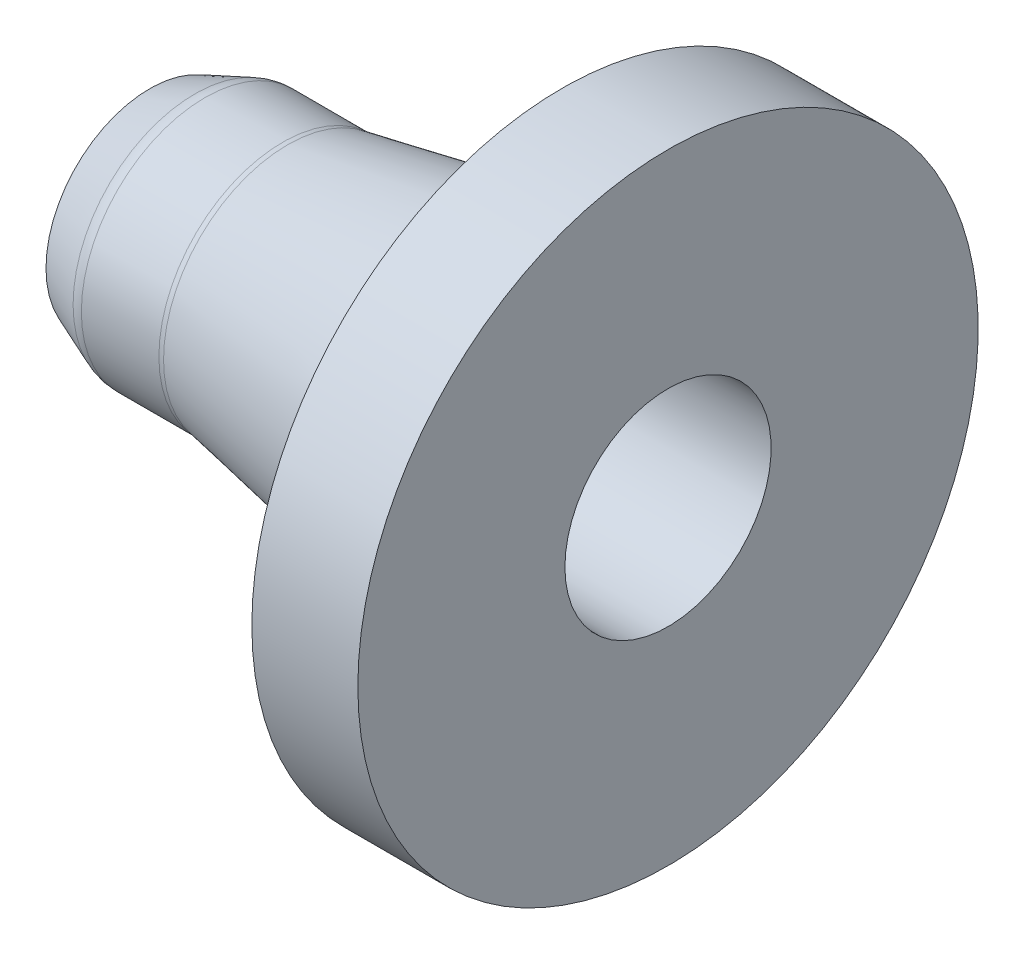
ISO-10303-21;
HEADER;
FILE_DESCRIPTION(('STEP AP214'),'2;1');
FILE_NAME('part.step','',(''),(''),'','','');
FILE_SCHEMA(('AUTOMOTIVE_DESIGN { 1 0 10303 214 1 1 1 1 }'));
ENDSEC;
DATA;
#1=APPLICATION_CONTEXT('core data for automotive mechanical design processes');
#2=APPLICATION_PROTOCOL_DEFINITION('international standard','automotive_design',2000,#1);
#3=PRODUCT_CONTEXT('',#1,'mechanical');
#4=PRODUCT('Part','Part','',(#3));
#5=PRODUCT_RELATED_PRODUCT_CATEGORY('part','',(#4));
#6=PRODUCT_DEFINITION_FORMATION('','',#4);
#7=PRODUCT_DEFINITION_CONTEXT('part definition',#1,'design');
#8=PRODUCT_DEFINITION('design','',#6,#7);
#9=PRODUCT_DEFINITION_SHAPE('','',#8);
#10=(LENGTH_UNIT() NAMED_UNIT(*) SI_UNIT(.MILLI.,.METRE.));
#11=(NAMED_UNIT(*) PLANE_ANGLE_UNIT() SI_UNIT($,.RADIAN.));
#12=(NAMED_UNIT(*) SI_UNIT($,.STERADIAN.) SOLID_ANGLE_UNIT());
#13=UNCERTAINTY_MEASURE_WITH_UNIT(LENGTH_MEASURE(1.E-05),#10,'distance_accuracy_value','');
#14=(GEOMETRIC_REPRESENTATION_CONTEXT(3) GLOBAL_UNCERTAINTY_ASSIGNED_CONTEXT((#13)) GLOBAL_UNIT_ASSIGNED_CONTEXT((#10,
#11,#12)) REPRESENTATION_CONTEXT('',''));
#15=CARTESIAN_POINT('',(0.,0.,0.));
#16=DIRECTION('',(0.,0.,1.));
#17=DIRECTION('',(1.,0.,0.));
#18=AXIS2_PLACEMENT_3D('',#15,#16,#17);
#19=CARTESIAN_POINT('',(0.,0.,0.));
#20=DIRECTION('',(-1.,0.,0.));
#21=DIRECTION('',(0.,0.,1.));
#22=AXIS2_PLACEMENT_3D('',#19,#20,#21);
#23=CYLINDRICAL_SURFACE('',#22,0.75);
#24=CARTESIAN_POINT('',(3.79395727756807,0.,0.));
#25=DIRECTION('',(-1.,0.,0.));
#26=DIRECTION('',(0.,0.,1.));
#27=AXIS2_PLACEMENT_3D('',#24,#25,#26);
#28=CIRCLE('',#27,0.75);
#29=CARTESIAN_POINT('',(3.79395727756807,0.,0.75));
#30=VERTEX_POINT('',#29);
#31=EDGE_CURVE('E76',#30,#30,#28,.T.);
#32=ORIENTED_EDGE('',*,*,#31,.F.);
#33=EDGE_LOOP('',(#32));
#34=FACE_BOUND('',#33,.T.);
#35=CARTESIAN_POINT('',(0.0239572775680751,0.,0.));
#36=DIRECTION('',(-1.,0.,0.));
#37=DIRECTION('',(0.,0.,1.));
#38=AXIS2_PLACEMENT_3D('',#35,#36,#37);
#39=CIRCLE('',#38,0.75);
#40=CARTESIAN_POINT('',(0.0239572775680751,0.,0.75));
#41=VERTEX_POINT('',#40);
#42=EDGE_CURVE('E55',#41,#41,#39,.T.);
#43=ORIENTED_EDGE('',*,*,#42,.T.);
#44=EDGE_LOOP('',(#43));
#45=FACE_BOUND('',#44,.T.);
#46=ADVANCED_FACE('F35',(#34,#45),#23,.F.);
#47=CARTESIAN_POINT('',(0.0239572775680752,0.75,0.));
#48=DIRECTION('',(1.,0.,0.));
#49=DIRECTION('',(0.,0.,-1.));
#50=AXIS2_PLACEMENT_3D('',#47,#48,#49);
#51=PLANE('',#50);
#52=ORIENTED_EDGE('',*,*,#42,.F.);
#53=EDGE_LOOP('',(#52));
#54=FACE_BOUND('',#53,.T.);
#55=CARTESIAN_POINT('',(0.0239572775680752,0.,0.));
#56=DIRECTION('',(-1.,0.,0.));
#57=DIRECTION('',(0.,0.,1.));
#58=AXIS2_PLACEMENT_3D('',#55,#56,#57);
#59=CIRCLE('',#58,0.754156771666013);
#60=CARTESIAN_POINT('',(0.0239572775680752,0.,0.754156771666013));
#61=VERTEX_POINT('',#60);
#62=EDGE_CURVE('E58',#61,#61,#59,.T.);
#63=ORIENTED_EDGE('',*,*,#62,.T.);
#64=EDGE_LOOP('',(#63));
#65=FACE_BOUND('',#64,.T.);
#66=ADVANCED_FACE('F84',(#54,#65),#51,.F.);
#67=CARTESIAN_POINT('',(0.388348543336103,0.,0.));
#68=DIRECTION('',(1.,0.,0.));
#69=DIRECTION('',(0.,0.,-1.));
#70=AXIS2_PLACEMENT_3D('',#67,#68,#69);
#71=CONICAL_SURFACE('',#70,0.9,0.38071152536673);
#72=CARTESIAN_POINT('',(0.352570071366835,0.,0.));
#73=DIRECTION('',(-1.,0.,0.));
#74=DIRECTION('',(0.,0.,1.));
#75=AXIS2_PLACEMENT_3D('',#72,#73,#74);
#76=CIRCLE('',#75,0.885680096239801);
#77=CARTESIAN_POINT('',(0.352570071366835,0.,0.885680096239801));
#78=VERTEX_POINT('',#77);
#79=EDGE_CURVE('E50',#78,#78,#76,.T.);
#80=ORIENTED_EDGE('',*,*,#79,.T.);
#81=EDGE_LOOP('',(#80));
#82=FACE_BOUND('',#81,.T.);
#83=ORIENTED_EDGE('',*,*,#62,.F.);
#84=EDGE_LOOP('',(#83));
#85=FACE_BOUND('',#84,.T.);
#86=ADVANCED_FACE('F90',(#82,#85),#71,.T.);
#87=CARTESIAN_POINT('',(0.,0.,0.));
#88=DIRECTION('',(-1.,0.,0.));
#89=DIRECTION('',(0.,0.,1.));
#90=AXIS2_PLACEMENT_3D('',#87,#88,#89);
#91=CYLINDRICAL_SURFACE('',#90,0.9);
#92=CARTESIAN_POINT('',(0.426886300148832,0.,0.));
#93=DIRECTION('',(1.,0.,0.));
#94=DIRECTION('',(0.,0.,-1.));
#95=AXIS2_PLACEMENT_3D('',#92,#93,#94);
#96=CIRCLE('',#95,0.9);
#97=CARTESIAN_POINT('',(0.426886300148832,0.,-0.9));
#98=VERTEX_POINT('',#97);
#99=EDGE_CURVE('E42',#98,#98,#96,.T.);
#100=ORIENTED_EDGE('',*,*,#99,.T.);
#101=EDGE_LOOP('',(#100));
#102=FACE_BOUND('',#101,.T.);
#103=CARTESIAN_POINT('',(0.990838542692331,0.,0.));
#104=DIRECTION('',(-1.,0.,0.));
#105=DIRECTION('',(0.,0.,1.));
#106=AXIS2_PLACEMENT_3D('',#103,#104,#105);
#107=CIRCLE('',#106,0.9);
#108=CARTESIAN_POINT('',(0.990838542692331,0.,0.9));
#109=VERTEX_POINT('',#108);
#110=EDGE_CURVE('E46',#109,#109,#107,.T.);
#111=ORIENTED_EDGE('',*,*,#110,.T.);
#112=EDGE_LOOP('',(#111));
#113=FACE_BOUND('',#112,.T.);
#114=ADVANCED_FACE('F95',(#102,#113),#91,.T.);
#115=CARTESIAN_POINT('',(2.27327082827081,0.,0.));
#116=DIRECTION('',(1.,0.,0.));
#117=DIRECTION('',(0.,0.,-1.));
#118=AXIS2_PLACEMENT_3D('',#115,#116,#117);
#119=CONICAL_SURFACE('',#118,1.1402736577201,0.187908852060765);
#120=CARTESIAN_POINT('',(1.02819953617437,0.,0.));
#121=DIRECTION('',(1.,0.,0.));
#122=DIRECTION('',(0.,0.,-1.));
#123=AXIS2_PLACEMENT_3D('',#120,#121,#122);
#124=CIRCLE('',#123,0.903520596076752);
#125=CARTESIAN_POINT('',(1.02819953617437,0.,-0.903520596076752));
#126=VERTEX_POINT('',#125);
#127=EDGE_CURVE('E10',#126,#126,#124,.T.);
#128=ORIENTED_EDGE('',*,*,#127,.T.);
#129=EDGE_LOOP('',(#128));
#130=FACE_BOUND('',#129,.T.);
#131=CARTESIAN_POINT('',(2.27327082827081,0.,0.));
#132=DIRECTION('',(-1.,0.,0.));
#133=DIRECTION('',(0.,0.,1.));
#134=AXIS2_PLACEMENT_3D('',#131,#132,#133);
#135=CIRCLE('',#134,1.1402736577201);
#136=CARTESIAN_POINT('',(2.27327082827081,0.,1.1402736577201));
#137=VERTEX_POINT('',#136);
#138=EDGE_CURVE('E61',#137,#137,#135,.T.);
#139=ORIENTED_EDGE('',*,*,#138,.T.);
#140=EDGE_LOOP('',(#139));
#141=FACE_BOUND('',#140,.T.);
#142=ADVANCED_FACE('F101',(#130,#141),#119,.T.);
#143=CARTESIAN_POINT('',(2.27327082827081,1.1402736577201,0.));
#144=DIRECTION('',(-1.,0.,0.));
#145=DIRECTION('',(0.,0.,1.));
#146=AXIS2_PLACEMENT_3D('',#143,#144,#145);
#147=PLANE('',#146);
#148=ORIENTED_EDGE('',*,*,#138,.F.);
#149=EDGE_LOOP('',(#148));
#150=FACE_BOUND('',#149,.T.);
#151=CARTESIAN_POINT('',(2.27327082827081,0.,0.));
#152=DIRECTION('',(-1.,0.,0.));
#153=DIRECTION('',(0.,0.,1.));
#154=AXIS2_PLACEMENT_3D('',#151,#152,#153);
#155=CIRCLE('',#154,0.965222219669481);
#156=CARTESIAN_POINT('',(2.27327082827081,0.,0.965222219669481));
#157=VERTEX_POINT('',#156);
#158=EDGE_CURVE('E64',#157,#157,#155,.T.);
#159=ORIENTED_EDGE('',*,*,#158,.T.);
#160=EDGE_LOOP('',(#159));
#161=FACE_BOUND('',#160,.T.);
#162=ADVANCED_FACE('F131',(#150,#161),#147,.F.);
#163=CARTESIAN_POINT('',(0.,0.,0.));
#164=DIRECTION('',(-1.,0.,0.));
#165=DIRECTION('',(0.,0.,1.));
#166=AXIS2_PLACEMENT_3D('',#163,#164,#165);
#167=CYLINDRICAL_SURFACE('',#166,0.965222219669481);
#168=ORIENTED_EDGE('',*,*,#158,.F.);
#169=EDGE_LOOP('',(#168));
#170=FACE_BOUND('',#169,.T.);
#171=CARTESIAN_POINT('',(3.02294652872588,0.,0.));
#172=DIRECTION('',(-1.,0.,0.));
#173=DIRECTION('',(0.,0.,1.));
#174=AXIS2_PLACEMENT_3D('',#171,#172,#173);
#175=CIRCLE('',#174,0.965222219669481);
#176=CARTESIAN_POINT('',(3.02294652872588,0.,0.965222219669481));
#177=VERTEX_POINT('',#176);
#178=EDGE_CURVE('E67',#177,#177,#175,.T.);
#179=ORIENTED_EDGE('',*,*,#178,.T.);
#180=EDGE_LOOP('',(#179));
#181=FACE_BOUND('',#180,.T.);
#182=ADVANCED_FACE('F127',(#170,#181),#167,.T.);
#183=CARTESIAN_POINT('',(3.02294652872588,0.965222219669481,0.));
#184=DIRECTION('',(1.,0.,0.));
#185=DIRECTION('',(0.,0.,-1.));
#186=AXIS2_PLACEMENT_3D('',#183,#184,#185);
#187=PLANE('',#186);
#188=ORIENTED_EDGE('',*,*,#178,.F.);
#189=EDGE_LOOP('',(#188));
#190=FACE_BOUND('',#189,.T.);
#191=CARTESIAN_POINT('',(3.02294652872588,0.,0.));
#192=DIRECTION('',(-1.,0.,0.));
#193=DIRECTION('',(0.,0.,1.));
#194=AXIS2_PLACEMENT_3D('',#191,#192,#193);
#195=CIRCLE('',#194,2.25603416267947);
#196=CARTESIAN_POINT('',(3.02294652872588,0.,2.25603416267947));
#197=VERTEX_POINT('',#196);
#198=EDGE_CURVE('E70',#197,#197,#195,.T.);
#199=ORIENTED_EDGE('',*,*,#198,.T.);
#200=EDGE_LOOP('',(#199));
#201=FACE_BOUND('',#200,.T.);
#202=ADVANCED_FACE('F120',(#190,#201),#187,.F.);
#203=CARTESIAN_POINT('',(0.,0.,0.));
#204=DIRECTION('',(-1.,0.,0.));
#205=DIRECTION('',(0.,0.,1.));
#206=AXIS2_PLACEMENT_3D('',#203,#204,#205);
#207=CYLINDRICAL_SURFACE('',#206,2.25603416267947);
#208=ORIENTED_EDGE('',*,*,#198,.F.);
#209=EDGE_LOOP('',(#208));
#210=FACE_BOUND('',#209,.T.);
#211=CARTESIAN_POINT('',(3.79395727756807,0.,0.));
#212=DIRECTION('',(-1.,0.,0.));
#213=DIRECTION('',(0.,0.,1.));
#214=AXIS2_PLACEMENT_3D('',#211,#212,#213);
#215=CIRCLE('',#214,2.25603416267947);
#216=CARTESIAN_POINT('',(3.79395727756807,0.,2.25603416267947));
#217=VERTEX_POINT('',#216);
#218=EDGE_CURVE('E73',#217,#217,#215,.T.);
#219=ORIENTED_EDGE('',*,*,#218,.T.);
#220=EDGE_LOOP('',(#219));
#221=FACE_BOUND('',#220,.T.);
#222=ADVANCED_FACE('F112',(#210,#221),#207,.T.);
#223=CARTESIAN_POINT('',(3.79395727756807,0.9,0.));
#224=DIRECTION('',(-1.,0.,0.));
#225=DIRECTION('',(0.,0.,1.));
#226=AXIS2_PLACEMENT_3D('',#223,#224,#225);
#227=PLANE('',#226);
#228=ORIENTED_EDGE('',*,*,#218,.F.);
#229=EDGE_LOOP('',(#228));
#230=FACE_BOUND('',#229,.T.);
#231=ORIENTED_EDGE('',*,*,#31,.T.);
#232=EDGE_LOOP('',(#231));
#233=FACE_BOUND('',#232,.T.);
#234=ADVANCED_FACE('F80',(#230,#233),#227,.F.);
#235=CARTESIAN_POINT('',(0.426886300148832,0.,0.));
#236=DIRECTION('',(1.,0.,0.));
#237=DIRECTION('',(0.,0.,-1.));
#238=AXIS2_PLACEMENT_3D('',#235,#236,#237);
#239=TOROIDAL_SURFACE('',#238,0.7,0.2);
#240=ORIENTED_EDGE('',*,*,#99,.F.);
#241=EDGE_LOOP('',(#240));
#242=FACE_BOUND('',#241,.T.);
#243=ORIENTED_EDGE('',*,*,#79,.F.);
#244=EDGE_LOOP('',(#243));
#245=FACE_BOUND('',#244,.T.);
#246=ADVANCED_FACE('F104',(#242,#245),#239,.T.);
#247=CARTESIAN_POINT('',(0.990838542692331,0.,0.));
#248=DIRECTION('',(-1.,0.,0.));
#249=DIRECTION('',(0.,0.,1.));
#250=AXIS2_PLACEMENT_3D('',#247,#248,#249);
#251=TOROIDAL_SURFACE('',#250,1.1,0.2);
#252=ORIENTED_EDGE('',*,*,#127,.F.);
#253=EDGE_LOOP('',(#252));
#254=FACE_BOUND('',#253,.T.);
#255=ORIENTED_EDGE('',*,*,#110,.F.);
#256=EDGE_LOOP('',(#255));
#257=FACE_BOUND('',#256,.T.);
#258=ADVANCED_FACE('F37',(#254,#257),#251,.F.);
#259=CLOSED_SHELL('',(#46,#66,#86,#114,#142,#162,#182,#202,#222,#234,#246,#258));
#260=MANIFOLD_SOLID_BREP('B2',#259);
#261=ADVANCED_BREP_SHAPE_REPRESENTATION('',(#18,#260),#14);
#262=SHAPE_DEFINITION_REPRESENTATION(#9,#261);
ENDSEC;
END-ISO-10303-21;
